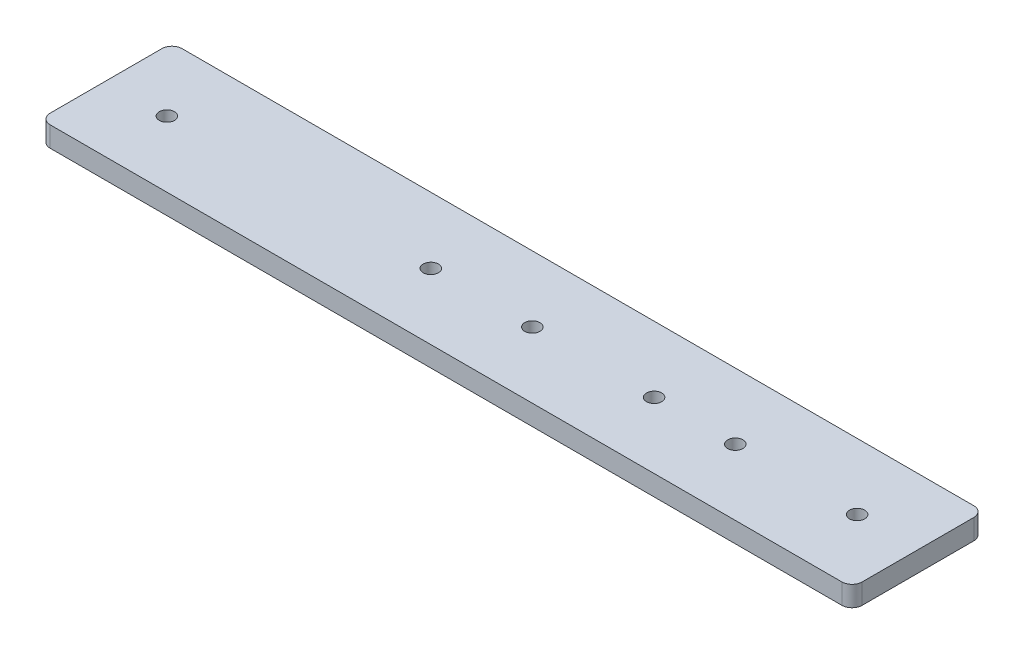
ISO-10303-21;
HEADER;
FILE_DESCRIPTION(('STEP AP214'),'2;1');
FILE_NAME('part.step','',(''),(''),'','','');
FILE_SCHEMA(('AUTOMOTIVE_DESIGN { 1 0 10303 214 1 1 1 1 }'));
ENDSEC;
DATA;
#1=APPLICATION_CONTEXT('core data for automotive mechanical design processes');
#2=APPLICATION_PROTOCOL_DEFINITION('international standard','automotive_design',2000,#1);
#3=PRODUCT_CONTEXT('',#1,'mechanical');
#4=PRODUCT('Part','Part','',(#3));
#5=PRODUCT_RELATED_PRODUCT_CATEGORY('part','',(#4));
#6=PRODUCT_DEFINITION_FORMATION('','',#4);
#7=PRODUCT_DEFINITION_CONTEXT('part definition',#1,'design');
#8=PRODUCT_DEFINITION('design','',#6,#7);
#9=PRODUCT_DEFINITION_SHAPE('','',#8);
#10=(LENGTH_UNIT() NAMED_UNIT(*) SI_UNIT(.MILLI.,.METRE.));
#11=(NAMED_UNIT(*) PLANE_ANGLE_UNIT() SI_UNIT($,.RADIAN.));
#12=(NAMED_UNIT(*) SI_UNIT($,.STERADIAN.) SOLID_ANGLE_UNIT());
#13=UNCERTAINTY_MEASURE_WITH_UNIT(LENGTH_MEASURE(1.E-05),#10,'distance_accuracy_value','');
#14=(GEOMETRIC_REPRESENTATION_CONTEXT(3) GLOBAL_UNCERTAINTY_ASSIGNED_CONTEXT((#13)) GLOBAL_UNIT_ASSIGNED_CONTEXT((#10,
#11,#12)) REPRESENTATION_CONTEXT('',''));
#15=CARTESIAN_POINT('',(0.,0.,0.));
#16=DIRECTION('',(0.,0.,1.));
#17=DIRECTION('',(1.,0.,0.));
#18=AXIS2_PLACEMENT_3D('',#15,#16,#17);
#19=CARTESIAN_POINT('',(0.,10.,0.));
#20=DIRECTION('',(0.,1.,0.));
#21=DIRECTION('',(0.,0.,1.));
#22=AXIS2_PLACEMENT_3D('',#19,#20,#21);
#23=PLANE('',#22);
#24=CARTESIAN_POINT('',(110.,10.,0.));
#25=DIRECTION('',(0.,1.,0.));
#26=DIRECTION('',(0.,0.,1.));
#27=AXIS2_PLACEMENT_3D('',#24,#25,#26);
#28=CIRCLE('',#27,3.75000000000001);
#29=CARTESIAN_POINT('',(110.,10.,3.75000000000001));
#30=VERTEX_POINT('',#29);
#31=EDGE_CURVE('E204',#30,#30,#28,.T.);
#32=ORIENTED_EDGE('',*,*,#31,.F.);
#33=EDGE_LOOP('',(#32));
#34=FACE_BOUND('',#33,.T.);
#35=CARTESIAN_POINT('',(9.99999999999998,10.,0.));
#36=DIRECTION('',(0.,1.,0.));
#37=DIRECTION('',(0.,0.,1.));
#38=AXIS2_PLACEMENT_3D('',#35,#36,#37);
#39=CIRCLE('',#38,3.75000000000001);
#40=CARTESIAN_POINT('',(9.99999999999998,10.,3.75000000000001));
#41=VERTEX_POINT('',#40);
#42=EDGE_CURVE('E195',#41,#41,#39,.T.);
#43=ORIENTED_EDGE('',*,*,#42,.F.);
#44=EDGE_LOOP('',(#43));
#45=FACE_BOUND('',#44,.T.);
#46=CARTESIAN_POINT('',(-170.,10.,0.));
#47=DIRECTION('',(0.,1.,0.));
#48=DIRECTION('',(0.,0.,1.));
#49=AXIS2_PLACEMENT_3D('',#46,#47,#48);
#50=CIRCLE('',#49,3.75000000000001);
#51=CARTESIAN_POINT('',(-170.,10.,3.75000000000001));
#52=VERTEX_POINT('',#51);
#53=EDGE_CURVE('E134',#52,#52,#50,.T.);
#54=ORIENTED_EDGE('',*,*,#53,.F.);
#55=EDGE_LOOP('',(#54));
#56=FACE_BOUND('',#55,.T.);
#57=DIRECTION('',(-1.,0.,0.));
#58=VECTOR('',#57,1.);
#59=CARTESIAN_POINT('',(200.,10.,-32.5));
#60=LINE('',#59,#58);
#61=CARTESIAN_POINT('',(195.,10.,-32.5));
#62=VERTEX_POINT('',#61);
#63=CARTESIAN_POINT('',(-195.,10.,-32.4999999999999));
#64=VERTEX_POINT('',#63);
#65=EDGE_CURVE('E142',#62,#64,#60,.T.);
#66=ORIENTED_EDGE('',*,*,#65,.T.);
#67=CARTESIAN_POINT('',(-195.,10.,-27.4999999999999));
#68=DIRECTION('',(0.,1.,0.));
#69=DIRECTION('',(0.,0.,1.));
#70=AXIS2_PLACEMENT_3D('',#67,#68,#69);
#71=CIRCLE('',#70,5.);
#72=CARTESIAN_POINT('',(-200.,10.,-27.4999999999999));
#73=VERTEX_POINT('',#72);
#74=EDGE_CURVE('E161',#64,#73,#71,.T.);
#75=ORIENTED_EDGE('',*,*,#74,.T.);
#76=DIRECTION('',(0.,0.,1.));
#77=VECTOR('',#76,1.);
#78=CARTESIAN_POINT('',(-200.,10.,32.5000000000001));
#79=LINE('',#78,#77);
#80=CARTESIAN_POINT('',(-200.,10.,27.5000000000001));
#81=VERTEX_POINT('',#80);
#82=EDGE_CURVE('E121',#73,#81,#79,.T.);
#83=ORIENTED_EDGE('',*,*,#82,.T.);
#84=CARTESIAN_POINT('',(-195.,10.,27.5000000000001));
#85=DIRECTION('',(0.,1.,0.));
#86=DIRECTION('',(0.,0.,1.));
#87=AXIS2_PLACEMENT_3D('',#84,#85,#86);
#88=CIRCLE('',#87,5.);
#89=CARTESIAN_POINT('',(-195.,10.,32.5000000000001));
#90=VERTEX_POINT('',#89);
#91=EDGE_CURVE('E156',#81,#90,#88,.T.);
#92=ORIENTED_EDGE('',*,*,#91,.T.);
#93=DIRECTION('',(1.,0.,0.));
#94=VECTOR('',#93,1.);
#95=CARTESIAN_POINT('',(200.,10.,32.5));
#96=LINE('',#95,#94);
#97=CARTESIAN_POINT('',(195.,10.,32.5));
#98=VERTEX_POINT('',#97);
#99=EDGE_CURVE('E175',#90,#98,#96,.T.);
#100=ORIENTED_EDGE('',*,*,#99,.T.);
#101=CARTESIAN_POINT('',(195.,10.,27.5));
#102=DIRECTION('',(0.,1.,0.));
#103=DIRECTION('',(0.,0.,1.));
#104=AXIS2_PLACEMENT_3D('',#101,#102,#103);
#105=CIRCLE('',#104,5.);
#106=CARTESIAN_POINT('',(200.,10.,27.5));
#107=VERTEX_POINT('',#106);
#108=EDGE_CURVE('E62',#98,#107,#105,.T.);
#109=ORIENTED_EDGE('',*,*,#108,.T.);
#110=DIRECTION('',(0.,0.,-1.));
#111=VECTOR('',#110,1.);
#112=CARTESIAN_POINT('',(200.,10.,32.5));
#113=LINE('',#112,#111);
#114=CARTESIAN_POINT('',(200.,10.,-27.5));
#115=VERTEX_POINT('',#114);
#116=EDGE_CURVE('E176',#107,#115,#113,.T.);
#117=ORIENTED_EDGE('',*,*,#116,.T.);
#118=CARTESIAN_POINT('',(195.,10.,-27.5));
#119=DIRECTION('',(0.,1.,0.));
#120=DIRECTION('',(0.,0.,1.));
#121=AXIS2_PLACEMENT_3D('',#118,#119,#120);
#122=CIRCLE('',#121,5.);
#123=EDGE_CURVE('E157',#115,#62,#122,.T.);
#124=ORIENTED_EDGE('',*,*,#123,.T.);
#125=EDGE_LOOP('',(#66,#75,#83,#92,#100,#109,#117,#124));
#126=FACE_BOUND('',#125,.T.);
#127=CARTESIAN_POINT('',(-40.,10.,0.));
#128=DIRECTION('',(0.,1.,0.));
#129=DIRECTION('',(0.,0.,1.));
#130=AXIS2_PLACEMENT_3D('',#127,#128,#129);
#131=CIRCLE('',#130,3.75000000000001);
#132=CARTESIAN_POINT('',(-40.,10.,3.75000000000001));
#133=VERTEX_POINT('',#132);
#134=EDGE_CURVE('E190',#133,#133,#131,.T.);
#135=ORIENTED_EDGE('',*,*,#134,.F.);
#136=EDGE_LOOP('',(#135));
#137=FACE_BOUND('',#136,.T.);
#138=CARTESIAN_POINT('',(70.,10.,0.));
#139=DIRECTION('',(0.,1.,0.));
#140=DIRECTION('',(0.,0.,1.));
#141=AXIS2_PLACEMENT_3D('',#138,#139,#140);
#142=CIRCLE('',#141,3.75000000000001);
#143=CARTESIAN_POINT('',(70.,10.,3.75000000000001));
#144=VERTEX_POINT('',#143);
#145=EDGE_CURVE('E196',#144,#144,#142,.T.);
#146=ORIENTED_EDGE('',*,*,#145,.F.);
#147=EDGE_LOOP('',(#146));
#148=FACE_BOUND('',#147,.T.);
#149=CARTESIAN_POINT('',(170.,10.,0.));
#150=DIRECTION('',(0.,1.,0.));
#151=DIRECTION('',(0.,0.,1.));
#152=AXIS2_PLACEMENT_3D('',#149,#150,#151);
#153=CIRCLE('',#152,3.75000000000001);
#154=CARTESIAN_POINT('',(170.,10.,3.75000000000001));
#155=VERTEX_POINT('',#154);
#156=EDGE_CURVE('E209',#155,#155,#153,.T.);
#157=ORIENTED_EDGE('',*,*,#156,.F.);
#158=EDGE_LOOP('',(#157));
#159=FACE_BOUND('',#158,.T.);
#160=ADVANCED_FACE('F39',(#34,#45,#56,#126,#137,#148,#159),#23,.T.);
#161=CARTESIAN_POINT('',(0.,0.,0.));
#162=DIRECTION('',(0.,1.,0.));
#163=DIRECTION('',(0.,0.,1.));
#164=AXIS2_PLACEMENT_3D('',#161,#162,#163);
#165=PLANE('',#164);
#166=DIRECTION('',(0.,0.,1.));
#167=VECTOR('',#166,1.);
#168=CARTESIAN_POINT('',(-200.,0.,32.5000000000001));
#169=LINE('',#168,#167);
#170=CARTESIAN_POINT('',(-200.,0.,-27.4999999999999));
#171=VERTEX_POINT('',#170);
#172=CARTESIAN_POINT('',(-200.,0.,27.5000000000001));
#173=VERTEX_POINT('',#172);
#174=EDGE_CURVE('E125',#171,#173,#169,.T.);
#175=ORIENTED_EDGE('',*,*,#174,.F.);
#176=CARTESIAN_POINT('',(-195.,0.,-27.4999999999999));
#177=DIRECTION('',(0.,1.,0.));
#178=DIRECTION('',(0.,0.,1.));
#179=AXIS2_PLACEMENT_3D('',#176,#177,#178);
#180=CIRCLE('',#179,5.);
#181=CARTESIAN_POINT('',(-195.,0.,-32.4999999999999));
#182=VERTEX_POINT('',#181);
#183=EDGE_CURVE('E104',#171,#182,#180,.F.);
#184=ORIENTED_EDGE('',*,*,#183,.T.);
#185=DIRECTION('',(-1.,0.,0.));
#186=VECTOR('',#185,1.);
#187=CARTESIAN_POINT('',(200.,0.,-32.5));
#188=LINE('',#187,#186);
#189=CARTESIAN_POINT('',(195.,0.,-32.5));
#190=VERTEX_POINT('',#189);
#191=EDGE_CURVE('E148',#190,#182,#188,.T.);
#192=ORIENTED_EDGE('',*,*,#191,.F.);
#193=CARTESIAN_POINT('',(195.,0.,-27.5));
#194=DIRECTION('',(0.,1.,0.));
#195=DIRECTION('',(0.,0.,1.));
#196=AXIS2_PLACEMENT_3D('',#193,#194,#195);
#197=CIRCLE('',#196,5.);
#198=CARTESIAN_POINT('',(200.,0.,-27.5));
#199=VERTEX_POINT('',#198);
#200=EDGE_CURVE('E117',#190,#199,#197,.F.);
#201=ORIENTED_EDGE('',*,*,#200,.T.);
#202=DIRECTION('',(0.,0.,-1.));
#203=VECTOR('',#202,1.);
#204=CARTESIAN_POINT('',(200.,0.,32.5));
#205=LINE('',#204,#203);
#206=CARTESIAN_POINT('',(200.,0.,27.5));
#207=VERTEX_POINT('',#206);
#208=EDGE_CURVE('E137',#207,#199,#205,.T.);
#209=ORIENTED_EDGE('',*,*,#208,.F.);
#210=CARTESIAN_POINT('',(195.,0.,27.5));
#211=DIRECTION('',(0.,1.,0.));
#212=DIRECTION('',(0.,0.,1.));
#213=AXIS2_PLACEMENT_3D('',#210,#211,#212);
#214=CIRCLE('',#213,5.);
#215=CARTESIAN_POINT('',(195.,0.,32.5));
#216=VERTEX_POINT('',#215);
#217=EDGE_CURVE('E147',#207,#216,#214,.F.);
#218=ORIENTED_EDGE('',*,*,#217,.T.);
#219=DIRECTION('',(1.,0.,0.));
#220=VECTOR('',#219,1.);
#221=CARTESIAN_POINT('',(200.,0.,32.5));
#222=LINE('',#221,#220);
#223=CARTESIAN_POINT('',(-195.,0.,32.5000000000001));
#224=VERTEX_POINT('',#223);
#225=EDGE_CURVE('E135',#224,#216,#222,.T.);
#226=ORIENTED_EDGE('',*,*,#225,.F.);
#227=CARTESIAN_POINT('',(-195.,0.,27.5000000000001));
#228=DIRECTION('',(0.,1.,0.));
#229=DIRECTION('',(0.,0.,1.));
#230=AXIS2_PLACEMENT_3D('',#227,#228,#229);
#231=CIRCLE('',#230,5.);
#232=EDGE_CURVE('E127',#224,#173,#231,.F.);
#233=ORIENTED_EDGE('',*,*,#232,.T.);
#234=EDGE_LOOP('',(#175,#184,#192,#201,#209,#218,#226,#233));
#235=FACE_BOUND('',#234,.T.);
#236=CARTESIAN_POINT('',(-170.,0.,0.));
#237=DIRECTION('',(0.,1.,0.));
#238=DIRECTION('',(0.,0.,1.));
#239=AXIS2_PLACEMENT_3D('',#236,#237,#238);
#240=CIRCLE('',#239,3.75000000000001);
#241=CARTESIAN_POINT('',(-170.,0.,3.75000000000001));
#242=VERTEX_POINT('',#241);
#243=EDGE_CURVE('E139',#242,#242,#240,.T.);
#244=ORIENTED_EDGE('',*,*,#243,.T.);
#245=EDGE_LOOP('',(#244));
#246=FACE_BOUND('',#245,.T.);
#247=CARTESIAN_POINT('',(-40.,0.,0.));
#248=DIRECTION('',(0.,1.,0.));
#249=DIRECTION('',(0.,0.,1.));
#250=AXIS2_PLACEMENT_3D('',#247,#248,#249);
#251=CIRCLE('',#250,3.75000000000001);
#252=CARTESIAN_POINT('',(-40.,0.,3.75000000000001));
#253=VERTEX_POINT('',#252);
#254=EDGE_CURVE('E186',#253,#253,#251,.T.);
#255=ORIENTED_EDGE('',*,*,#254,.T.);
#256=EDGE_LOOP('',(#255));
#257=FACE_BOUND('',#256,.T.);
#258=CARTESIAN_POINT('',(9.99999999999998,0.,0.));
#259=DIRECTION('',(0.,1.,0.));
#260=DIRECTION('',(0.,0.,1.));
#261=AXIS2_PLACEMENT_3D('',#258,#259,#260);
#262=CIRCLE('',#261,3.75000000000001);
#263=CARTESIAN_POINT('',(9.99999999999998,0.,3.75000000000001));
#264=VERTEX_POINT('',#263);
#265=EDGE_CURVE('E191',#264,#264,#262,.T.);
#266=ORIENTED_EDGE('',*,*,#265,.T.);
#267=EDGE_LOOP('',(#266));
#268=FACE_BOUND('',#267,.T.);
#269=CARTESIAN_POINT('',(70.,0.,0.));
#270=DIRECTION('',(0.,1.,0.));
#271=DIRECTION('',(0.,0.,1.));
#272=AXIS2_PLACEMENT_3D('',#269,#270,#271);
#273=CIRCLE('',#272,3.75000000000001);
#274=CARTESIAN_POINT('',(70.,0.,3.75000000000001));
#275=VERTEX_POINT('',#274);
#276=EDGE_CURVE('E203',#275,#275,#273,.T.);
#277=ORIENTED_EDGE('',*,*,#276,.T.);
#278=EDGE_LOOP('',(#277));
#279=FACE_BOUND('',#278,.T.);
#280=CARTESIAN_POINT('',(110.,0.,0.));
#281=DIRECTION('',(0.,1.,0.));
#282=DIRECTION('',(0.,0.,1.));
#283=AXIS2_PLACEMENT_3D('',#280,#281,#282);
#284=CIRCLE('',#283,3.75000000000001);
#285=CARTESIAN_POINT('',(110.,0.,3.75000000000001));
#286=VERTEX_POINT('',#285);
#287=EDGE_CURVE('E210',#286,#286,#284,.T.);
#288=ORIENTED_EDGE('',*,*,#287,.T.);
#289=EDGE_LOOP('',(#288));
#290=FACE_BOUND('',#289,.T.);
#291=CARTESIAN_POINT('',(170.,0.,0.));
#292=DIRECTION('',(0.,1.,0.));
#293=DIRECTION('',(0.,0.,1.));
#294=AXIS2_PLACEMENT_3D('',#291,#292,#293);
#295=CIRCLE('',#294,3.75000000000001);
#296=CARTESIAN_POINT('',(170.,0.,3.75000000000001));
#297=VERTEX_POINT('',#296);
#298=EDGE_CURVE('E213',#297,#297,#295,.T.);
#299=ORIENTED_EDGE('',*,*,#298,.T.);
#300=EDGE_LOOP('',(#299));
#301=FACE_BOUND('',#300,.T.);
#302=ADVANCED_FACE('F129',(#235,#246,#257,#268,#279,#290,#301),#165,.F.);
#303=CARTESIAN_POINT('',(-200.,10.,32.5000000000001));
#304=DIRECTION('',(1.,0.,0.));
#305=DIRECTION('',(0.,0.,-1.));
#306=AXIS2_PLACEMENT_3D('',#303,#304,#305);
#307=PLANE('',#306);
#308=ORIENTED_EDGE('',*,*,#82,.F.);
#309=DIRECTION('',(0.,-1.,0.));
#310=VECTOR('',#309,1.);
#311=CARTESIAN_POINT('',(-200.,10.,-27.4999999999999));
#312=LINE('',#311,#310);
#313=EDGE_CURVE('E108',#73,#171,#312,.T.);
#314=ORIENTED_EDGE('',*,*,#313,.T.);
#315=ORIENTED_EDGE('',*,*,#174,.T.);
#316=DIRECTION('',(0.,-1.,0.));
#317=VECTOR('',#316,1.);
#318=CARTESIAN_POINT('',(-200.,10.,27.5000000000001));
#319=LINE('',#318,#317);
#320=EDGE_CURVE('E130',#173,#81,#319,.F.);
#321=ORIENTED_EDGE('',*,*,#320,.T.);
#322=EDGE_LOOP('',(#308,#314,#315,#321));
#323=FACE_BOUND('',#322,.T.);
#324=ADVANCED_FACE('F122',(#323),#307,.F.);
#325=CARTESIAN_POINT('',(200.,10.,32.5));
#326=DIRECTION('',(0.,0.,-1.));
#327=DIRECTION('',(-1.,0.,0.));
#328=AXIS2_PLACEMENT_3D('',#325,#326,#327);
#329=PLANE('',#328);
#330=ORIENTED_EDGE('',*,*,#225,.T.);
#331=DIRECTION('',(0.,-1.,0.));
#332=VECTOR('',#331,1.);
#333=CARTESIAN_POINT('',(195.,10.,32.5));
#334=LINE('',#333,#332);
#335=EDGE_CURVE('E11',#216,#98,#334,.F.);
#336=ORIENTED_EDGE('',*,*,#335,.T.);
#337=ORIENTED_EDGE('',*,*,#99,.F.);
#338=DIRECTION('',(0.,-1.,0.));
#339=VECTOR('',#338,1.);
#340=CARTESIAN_POINT('',(-195.,10.,32.5000000000001));
#341=LINE('',#340,#339);
#342=EDGE_CURVE('E50',#90,#224,#341,.T.);
#343=ORIENTED_EDGE('',*,*,#342,.T.);
#344=EDGE_LOOP('',(#330,#336,#337,#343));
#345=FACE_BOUND('',#344,.T.);
#346=ADVANCED_FACE('F168',(#345),#329,.F.);
#347=CARTESIAN_POINT('',(200.,10.,32.5));
#348=DIRECTION('',(-1.,0.,0.));
#349=DIRECTION('',(0.,0.,1.));
#350=AXIS2_PLACEMENT_3D('',#347,#348,#349);
#351=PLANE('',#350);
#352=ORIENTED_EDGE('',*,*,#208,.T.);
#353=DIRECTION('',(0.,-1.,0.));
#354=VECTOR('',#353,1.);
#355=CARTESIAN_POINT('',(200.,10.,-27.5));
#356=LINE('',#355,#354);
#357=EDGE_CURVE('E53',#199,#115,#356,.F.);
#358=ORIENTED_EDGE('',*,*,#357,.T.);
#359=ORIENTED_EDGE('',*,*,#116,.F.);
#360=DIRECTION('',(0.,-1.,0.));
#361=VECTOR('',#360,1.);
#362=CARTESIAN_POINT('',(200.,10.,27.5));
#363=LINE('',#362,#361);
#364=EDGE_CURVE('E162',#107,#207,#363,.T.);
#365=ORIENTED_EDGE('',*,*,#364,.T.);
#366=EDGE_LOOP('',(#352,#358,#359,#365));
#367=FACE_BOUND('',#366,.T.);
#368=ADVANCED_FACE('F179',(#367),#351,.F.);
#369=CARTESIAN_POINT('',(200.,10.,-32.5));
#370=DIRECTION('',(0.,0.,1.));
#371=DIRECTION('',(1.,0.,0.));
#372=AXIS2_PLACEMENT_3D('',#369,#370,#371);
#373=PLANE('',#372);
#374=ORIENTED_EDGE('',*,*,#191,.T.);
#375=DIRECTION('',(0.,-1.,0.));
#376=VECTOR('',#375,1.);
#377=CARTESIAN_POINT('',(-195.,10.,-32.4999999999999));
#378=LINE('',#377,#376);
#379=EDGE_CURVE('E109',#182,#64,#378,.F.);
#380=ORIENTED_EDGE('',*,*,#379,.T.);
#381=ORIENTED_EDGE('',*,*,#65,.F.);
#382=DIRECTION('',(0.,-1.,0.));
#383=VECTOR('',#382,1.);
#384=CARTESIAN_POINT('',(195.,10.,-32.5));
#385=LINE('',#384,#383);
#386=EDGE_CURVE('E113',#62,#190,#385,.T.);
#387=ORIENTED_EDGE('',*,*,#386,.T.);
#388=EDGE_LOOP('',(#374,#380,#381,#387));
#389=FACE_BOUND('',#388,.T.);
#390=ADVANCED_FACE('F237',(#389),#373,.F.);
#391=CARTESIAN_POINT('',(-170.,10.,0.));
#392=DIRECTION('',(0.,-1.,0.));
#393=DIRECTION('',(0.,0.,-1.));
#394=AXIS2_PLACEMENT_3D('',#391,#392,#393);
#395=CYLINDRICAL_SURFACE('',#394,3.75000000000001);
#396=ORIENTED_EDGE('',*,*,#53,.T.);
#397=EDGE_LOOP('',(#396));
#398=FACE_BOUND('',#397,.T.);
#399=ORIENTED_EDGE('',*,*,#243,.F.);
#400=EDGE_LOOP('',(#399));
#401=FACE_BOUND('',#400,.T.);
#402=ADVANCED_FACE('F233',(#398,#401),#395,.F.);
#403=CARTESIAN_POINT('',(-40.,10.,0.));
#404=DIRECTION('',(0.,-1.,0.));
#405=DIRECTION('',(0.,0.,-1.));
#406=AXIS2_PLACEMENT_3D('',#403,#404,#405);
#407=CYLINDRICAL_SURFACE('',#406,3.75000000000001);
#408=ORIENTED_EDGE('',*,*,#134,.T.);
#409=EDGE_LOOP('',(#408));
#410=FACE_BOUND('',#409,.T.);
#411=ORIENTED_EDGE('',*,*,#254,.F.);
#412=EDGE_LOOP('',(#411));
#413=FACE_BOUND('',#412,.T.);
#414=ADVANCED_FACE('F281',(#410,#413),#407,.F.);
#415=CARTESIAN_POINT('',(9.99999999999998,10.,0.));
#416=DIRECTION('',(0.,-1.,0.));
#417=DIRECTION('',(0.,0.,-1.));
#418=AXIS2_PLACEMENT_3D('',#415,#416,#417);
#419=CYLINDRICAL_SURFACE('',#418,3.75000000000001);
#420=ORIENTED_EDGE('',*,*,#42,.T.);
#421=EDGE_LOOP('',(#420));
#422=FACE_BOUND('',#421,.T.);
#423=ORIENTED_EDGE('',*,*,#265,.F.);
#424=EDGE_LOOP('',(#423));
#425=FACE_BOUND('',#424,.T.);
#426=ADVANCED_FACE('F268',(#422,#425),#419,.F.);
#427=CARTESIAN_POINT('',(70.,10.,0.));
#428=DIRECTION('',(0.,-1.,0.));
#429=DIRECTION('',(0.,0.,-1.));
#430=AXIS2_PLACEMENT_3D('',#427,#428,#429);
#431=CYLINDRICAL_SURFACE('',#430,3.75000000000001);
#432=ORIENTED_EDGE('',*,*,#145,.T.);
#433=EDGE_LOOP('',(#432));
#434=FACE_BOUND('',#433,.T.);
#435=ORIENTED_EDGE('',*,*,#276,.F.);
#436=EDGE_LOOP('',(#435));
#437=FACE_BOUND('',#436,.T.);
#438=ADVANCED_FACE('F262',(#434,#437),#431,.F.);
#439=CARTESIAN_POINT('',(110.,10.,0.));
#440=DIRECTION('',(0.,-1.,0.));
#441=DIRECTION('',(0.,0.,-1.));
#442=AXIS2_PLACEMENT_3D('',#439,#440,#441);
#443=CYLINDRICAL_SURFACE('',#442,3.75000000000001);
#444=ORIENTED_EDGE('',*,*,#31,.T.);
#445=EDGE_LOOP('',(#444));
#446=FACE_BOUND('',#445,.T.);
#447=ORIENTED_EDGE('',*,*,#287,.F.);
#448=EDGE_LOOP('',(#447));
#449=FACE_BOUND('',#448,.T.);
#450=ADVANCED_FACE('F270',(#446,#449),#443,.F.);
#451=CARTESIAN_POINT('',(170.,10.,0.));
#452=DIRECTION('',(0.,-1.,0.));
#453=DIRECTION('',(0.,0.,-1.));
#454=AXIS2_PLACEMENT_3D('',#451,#452,#453);
#455=CYLINDRICAL_SURFACE('',#454,3.75000000000001);
#456=ORIENTED_EDGE('',*,*,#156,.T.);
#457=EDGE_LOOP('',(#456));
#458=FACE_BOUND('',#457,.T.);
#459=ORIENTED_EDGE('',*,*,#298,.F.);
#460=EDGE_LOOP('',(#459));
#461=FACE_BOUND('',#460,.T.);
#462=ADVANCED_FACE('F218',(#458,#461),#455,.F.);
#463=CARTESIAN_POINT('',(-195.,10.,-27.4999999999999));
#464=DIRECTION('',(0.,-1.,0.));
#465=DIRECTION('',(0.,0.,-1.));
#466=AXIS2_PLACEMENT_3D('',#463,#464,#465);
#467=CYLINDRICAL_SURFACE('',#466,5.);
#468=ORIENTED_EDGE('',*,*,#74,.F.);
#469=ORIENTED_EDGE('',*,*,#379,.F.);
#470=ORIENTED_EDGE('',*,*,#183,.F.);
#471=ORIENTED_EDGE('',*,*,#313,.F.);
#472=EDGE_LOOP('',(#468,#469,#470,#471));
#473=FACE_BOUND('',#472,.T.);
#474=ADVANCED_FACE('F107',(#473),#467,.T.);
#475=CARTESIAN_POINT('',(195.,10.,-27.5));
#476=DIRECTION('',(0.,-1.,0.));
#477=DIRECTION('',(0.,0.,-1.));
#478=AXIS2_PLACEMENT_3D('',#475,#476,#477);
#479=CYLINDRICAL_SURFACE('',#478,5.);
#480=ORIENTED_EDGE('',*,*,#123,.F.);
#481=ORIENTED_EDGE('',*,*,#357,.F.);
#482=ORIENTED_EDGE('',*,*,#200,.F.);
#483=ORIENTED_EDGE('',*,*,#386,.F.);
#484=EDGE_LOOP('',(#480,#481,#482,#483));
#485=FACE_BOUND('',#484,.T.);
#486=ADVANCED_FACE('F248',(#485),#479,.T.);
#487=CARTESIAN_POINT('',(195.,10.,27.5));
#488=DIRECTION('',(0.,-1.,0.));
#489=DIRECTION('',(0.,0.,-1.));
#490=AXIS2_PLACEMENT_3D('',#487,#488,#489);
#491=CYLINDRICAL_SURFACE('',#490,5.);
#492=ORIENTED_EDGE('',*,*,#108,.F.);
#493=ORIENTED_EDGE('',*,*,#335,.F.);
#494=ORIENTED_EDGE('',*,*,#217,.F.);
#495=ORIENTED_EDGE('',*,*,#364,.F.);
#496=EDGE_LOOP('',(#492,#493,#494,#495));
#497=FACE_BOUND('',#496,.T.);
#498=ADVANCED_FACE('F178',(#497),#491,.T.);
#499=CARTESIAN_POINT('',(-195.,10.,27.5000000000001));
#500=DIRECTION('',(0.,-1.,0.));
#501=DIRECTION('',(0.,0.,-1.));
#502=AXIS2_PLACEMENT_3D('',#499,#500,#501);
#503=CYLINDRICAL_SURFACE('',#502,5.);
#504=ORIENTED_EDGE('',*,*,#91,.F.);
#505=ORIENTED_EDGE('',*,*,#320,.F.);
#506=ORIENTED_EDGE('',*,*,#232,.F.);
#507=ORIENTED_EDGE('',*,*,#342,.F.);
#508=EDGE_LOOP('',(#504,#505,#506,#507));
#509=FACE_BOUND('',#508,.T.);
#510=ADVANCED_FACE('F41',(#509),#503,.T.);
#511=CLOSED_SHELL('',(#160,#302,#324,#346,#368,#390,#402,#414,#426,#438,#450,#462,#474,#486,
#498,#510));
#512=MANIFOLD_SOLID_BREP('B2',#511);
#513=ADVANCED_BREP_SHAPE_REPRESENTATION('',(#18,#512),#14);
#514=SHAPE_DEFINITION_REPRESENTATION(#9,#513);
ENDSEC;
END-ISO-10303-21;
